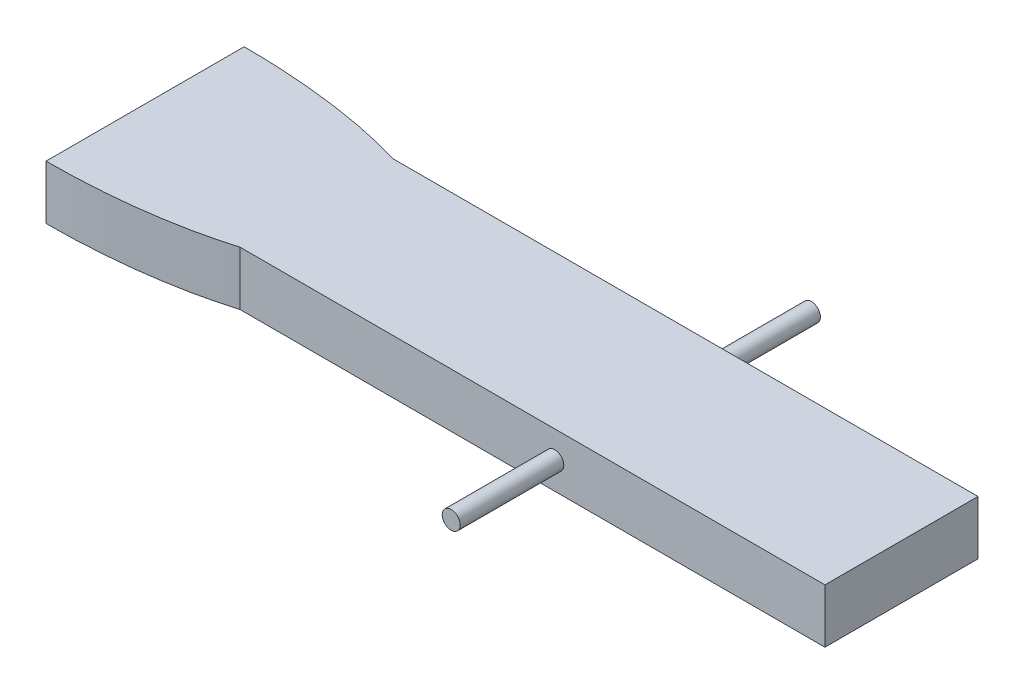
ISO-10303-21;
HEADER;
FILE_DESCRIPTION(('STEP AP214'),'2;1');
FILE_NAME('part.step','',(''),(''),'','','');
FILE_SCHEMA(('AUTOMOTIVE_DESIGN { 1 0 10303 214 1 1 1 1 }'));
ENDSEC;
DATA;
#1=APPLICATION_CONTEXT('core data for automotive mechanical design processes');
#2=APPLICATION_PROTOCOL_DEFINITION('international standard','automotive_design',2000,#1);
#3=PRODUCT_CONTEXT('',#1,'mechanical');
#4=PRODUCT('Part','Part','',(#3));
#5=PRODUCT_RELATED_PRODUCT_CATEGORY('part','',(#4));
#6=PRODUCT_DEFINITION_FORMATION('','',#4);
#7=PRODUCT_DEFINITION_CONTEXT('part definition',#1,'design');
#8=PRODUCT_DEFINITION('design','',#6,#7);
#9=PRODUCT_DEFINITION_SHAPE('','',#8);
#10=(LENGTH_UNIT() NAMED_UNIT(*) SI_UNIT(.MILLI.,.METRE.));
#11=(NAMED_UNIT(*) PLANE_ANGLE_UNIT() SI_UNIT($,.RADIAN.));
#12=(NAMED_UNIT(*) SI_UNIT($,.STERADIAN.) SOLID_ANGLE_UNIT());
#13=UNCERTAINTY_MEASURE_WITH_UNIT(LENGTH_MEASURE(1.E-05),#10,'distance_accuracy_value','');
#14=(GEOMETRIC_REPRESENTATION_CONTEXT(3) GLOBAL_UNCERTAINTY_ASSIGNED_CONTEXT((#13)) GLOBAL_UNIT_ASSIGNED_CONTEXT((#10,
#11,#12)) REPRESENTATION_CONTEXT('',''));
#15=CARTESIAN_POINT('',(0.,0.,0.));
#16=DIRECTION('',(0.,0.,1.));
#17=DIRECTION('',(1.,0.,0.));
#18=AXIS2_PLACEMENT_3D('',#15,#16,#17);
#19=CARTESIAN_POINT('',(-27.,1.5,5.5));
#20=DIRECTION('',(0.,-1.,0.));
#21=DIRECTION('',(1.,0.,0.));
#22=AXIS2_PLACEMENT_3D('',#19,#20,#21);
#23=PLANE('',#22);
#24=CARTESIAN_POINT('',(-27.,1.5,0.));
#25=DIRECTION('',(0.,1.,0.));
#26=DIRECTION('',(1.,0.,0.));
#27=AXIS2_PLACEMENT_3D('',#24,#25,#26);
#28=ELLIPSE('',#27,15.,5.5);
#29=CARTESIAN_POINT('',(-17.4789272428849,1.5,-4.25000000000001));
#30=VERTEX_POINT('',#29);
#31=CARTESIAN_POINT('',(-27.,1.5,-5.5));
#32=VERTEX_POINT('',#31);
#33=EDGE_CURVE('E132',#30,#32,#28,.T.);
#34=ORIENTED_EDGE('',*,*,#33,.T.);
#35=DIRECTION('',(0.,0.,-1.));
#36=VECTOR('',#35,1.);
#37=CARTESIAN_POINT('',(-27.,1.5,5.5));
#38=LINE('',#37,#36);
#39=CARTESIAN_POINT('',(-27.,1.5,5.5));
#40=VERTEX_POINT('',#39);
#41=EDGE_CURVE('E168',#40,#32,#38,.T.);
#42=ORIENTED_EDGE('',*,*,#41,.F.);
#43=CARTESIAN_POINT('',(-27.,1.5,0.));
#44=DIRECTION('',(0.,1.,0.));
#45=DIRECTION('',(1.,0.,0.));
#46=AXIS2_PLACEMENT_3D('',#43,#44,#45);
#47=ELLIPSE('',#46,15.,5.5);
#48=CARTESIAN_POINT('',(-17.4789272428849,1.5,4.25000000000002));
#49=VERTEX_POINT('',#48);
#50=EDGE_CURVE('E62',#40,#49,#47,.T.);
#51=ORIENTED_EDGE('',*,*,#50,.T.);
#52=DIRECTION('',(1.,0.,0.));
#53=VECTOR('',#52,1.);
#54=CARTESIAN_POINT('',(15.,1.5,4.25));
#55=LINE('',#54,#53);
#56=CARTESIAN_POINT('',(15.,1.5,4.25));
#57=VERTEX_POINT('',#56);
#58=EDGE_CURVE('E106',#49,#57,#55,.T.);
#59=ORIENTED_EDGE('',*,*,#58,.T.);
#60=DIRECTION('',(0.,0.,-1.));
#61=VECTOR('',#60,1.);
#62=CARTESIAN_POINT('',(15.,1.5,5.5));
#63=LINE('',#62,#61);
#64=CARTESIAN_POINT('',(15.,1.5,-4.25));
#65=VERTEX_POINT('',#64);
#66=EDGE_CURVE('E160',#57,#65,#63,.T.);
#67=ORIENTED_EDGE('',*,*,#66,.T.);
#68=DIRECTION('',(-1.,0.,0.));
#69=VECTOR('',#68,1.);
#70=CARTESIAN_POINT('',(15.,1.5,-4.25));
#71=LINE('',#70,#69);
#72=EDGE_CURVE('E141',#65,#30,#71,.T.);
#73=ORIENTED_EDGE('',*,*,#72,.T.);
#74=EDGE_LOOP('',(#34,#42,#51,#59,#67,#73));
#75=FACE_BOUND('',#74,.T.);
#76=ADVANCED_FACE('F46',(#75),#23,.F.);
#77=CARTESIAN_POINT('',(-27.,-1.5,5.5));
#78=DIRECTION('',(0.,1.,0.));
#79=DIRECTION('',(-1.,0.,0.));
#80=AXIS2_PLACEMENT_3D('',#77,#78,#79);
#81=PLANE('',#80);
#82=CARTESIAN_POINT('',(-27.,-1.5,0.));
#83=DIRECTION('',(0.,1.,0.));
#84=DIRECTION('',(1.,0.,0.));
#85=AXIS2_PLACEMENT_3D('',#82,#83,#84);
#86=ELLIPSE('',#85,15.,5.5);
#87=CARTESIAN_POINT('',(-17.4789272428849,-1.5,-4.25000000000001));
#88=VERTEX_POINT('',#87);
#89=CARTESIAN_POINT('',(-27.,-1.5,-5.5));
#90=VERTEX_POINT('',#89);
#91=EDGE_CURVE('E70',#88,#90,#86,.T.);
#92=ORIENTED_EDGE('',*,*,#91,.F.);
#93=DIRECTION('',(-1.,0.,0.));
#94=VECTOR('',#93,1.);
#95=CARTESIAN_POINT('',(15.,-1.5,-4.25));
#96=LINE('',#95,#94);
#97=CARTESIAN_POINT('',(15.,-1.5,-4.25));
#98=VERTEX_POINT('',#97);
#99=EDGE_CURVE('E109',#98,#88,#96,.T.);
#100=ORIENTED_EDGE('',*,*,#99,.F.);
#101=DIRECTION('',(0.,0.,-1.));
#102=VECTOR('',#101,1.);
#103=CARTESIAN_POINT('',(15.,-1.49999999999999,5.5));
#104=LINE('',#103,#102);
#105=CARTESIAN_POINT('',(15.,-1.5,4.25));
#106=VERTEX_POINT('',#105);
#107=EDGE_CURVE('E123',#106,#98,#104,.T.);
#108=ORIENTED_EDGE('',*,*,#107,.F.);
#109=DIRECTION('',(1.,0.,0.));
#110=VECTOR('',#109,1.);
#111=CARTESIAN_POINT('',(15.,-1.5,4.25));
#112=LINE('',#111,#110);
#113=CARTESIAN_POINT('',(-17.4789272428849,-1.5,4.25000000000002));
#114=VERTEX_POINT('',#113);
#115=EDGE_CURVE('E103',#114,#106,#112,.T.);
#116=ORIENTED_EDGE('',*,*,#115,.F.);
#117=CARTESIAN_POINT('',(-27.,-1.5,0.));
#118=DIRECTION('',(0.,1.,0.));
#119=DIRECTION('',(1.,0.,0.));
#120=AXIS2_PLACEMENT_3D('',#117,#118,#119);
#121=ELLIPSE('',#120,15.,5.5);
#122=CARTESIAN_POINT('',(-27.,-1.5,5.5));
#123=VERTEX_POINT('',#122);
#124=EDGE_CURVE('E112',#123,#114,#121,.T.);
#125=ORIENTED_EDGE('',*,*,#124,.F.);
#126=DIRECTION('',(0.,0.,-1.));
#127=VECTOR('',#126,1.);
#128=CARTESIAN_POINT('',(-27.,-1.5,5.5));
#129=LINE('',#128,#127);
#130=EDGE_CURVE('E166',#123,#90,#129,.T.);
#131=ORIENTED_EDGE('',*,*,#130,.T.);
#132=EDGE_LOOP('',(#92,#100,#108,#116,#125,#131));
#133=FACE_BOUND('',#132,.T.);
#134=ADVANCED_FACE('F120',(#133),#81,.F.);
#135=CARTESIAN_POINT('',(15.,-1.49999999999999,5.5));
#136=DIRECTION('',(-1.,0.,0.));
#137=DIRECTION('',(0.,0.,1.));
#138=AXIS2_PLACEMENT_3D('',#135,#136,#137);
#139=PLANE('',#138);
#140=DIRECTION('',(0.,1.,0.));
#141=VECTOR('',#140,1.);
#142=CARTESIAN_POINT('',(15.,-1.5,-4.25));
#143=LINE('',#142,#141);
#144=EDGE_CURVE('E149',#98,#65,#143,.T.);
#145=ORIENTED_EDGE('',*,*,#144,.T.);
#146=ORIENTED_EDGE('',*,*,#66,.F.);
#147=DIRECTION('',(0.,1.,0.));
#148=VECTOR('',#147,1.);
#149=CARTESIAN_POINT('',(15.,-1.5,4.25));
#150=LINE('',#149,#148);
#151=EDGE_CURVE('E108',#106,#57,#150,.T.);
#152=ORIENTED_EDGE('',*,*,#151,.F.);
#153=ORIENTED_EDGE('',*,*,#107,.T.);
#154=EDGE_LOOP('',(#145,#146,#152,#153));
#155=FACE_BOUND('',#154,.T.);
#156=ADVANCED_FACE('F198',(#155),#139,.F.);
#157=CARTESIAN_POINT('',(-27.,-1.5,5.5));
#158=DIRECTION('',(1.,0.,0.));
#159=DIRECTION('',(0.,0.,-1.));
#160=AXIS2_PLACEMENT_3D('',#157,#158,#159);
#161=PLANE('',#160);
#162=ORIENTED_EDGE('',*,*,#41,.T.);
#163=DIRECTION('',(0.,-1.,0.));
#164=VECTOR('',#163,1.);
#165=CARTESIAN_POINT('',(-27.,-1.5,-5.5));
#166=LINE('',#165,#164);
#167=EDGE_CURVE('E148',#32,#90,#166,.T.);
#168=ORIENTED_EDGE('',*,*,#167,.T.);
#169=ORIENTED_EDGE('',*,*,#130,.F.);
#170=DIRECTION('',(0.,-1.,0.));
#171=VECTOR('',#170,1.);
#172=CARTESIAN_POINT('',(-27.,-1.5,5.5));
#173=LINE('',#172,#171);
#174=EDGE_CURVE('E114',#40,#123,#173,.T.);
#175=ORIENTED_EDGE('',*,*,#174,.F.);
#176=EDGE_LOOP('',(#162,#168,#169,#175));
#177=FACE_BOUND('',#176,.T.);
#178=ADVANCED_FACE('F201',(#177),#161,.F.);
#179=DIRECTION('',(0.,1.,0.));
#180=VECTOR('',#179,1.);
#181=SURFACE_OF_LINEAR_EXTRUSION('',#86,#180);
#182=ORIENTED_EDGE('',*,*,#33,.F.);
#183=DIRECTION('',(0.,1.,0.));
#184=VECTOR('',#183,1.);
#185=CARTESIAN_POINT('',(-17.4789272428849,-1.5,-4.25000000000001));
#186=LINE('',#185,#184);
#187=EDGE_CURVE('E145',#88,#30,#186,.T.);
#188=ORIENTED_EDGE('',*,*,#187,.F.);
#189=ORIENTED_EDGE('',*,*,#91,.T.);
#190=ORIENTED_EDGE('',*,*,#167,.F.);
#191=EDGE_LOOP('',(#182,#188,#189,#190));
#192=FACE_BOUND('',#191,.T.);
#193=ADVANCED_FACE('F190',(#192),#181,.T.);
#194=CARTESIAN_POINT('',(15.,-1.5,-4.25));
#195=DIRECTION('',(0.,0.,-1.));
#196=DIRECTION('',(-1.,0.,0.));
#197=AXIS2_PLACEMENT_3D('',#194,#195,#196);
#198=PLANE('',#197);
#199=CARTESIAN_POINT('',(0.,0.,-4.25));
#200=DIRECTION('',(0.,0.,-1.));
#201=DIRECTION('',(-1.,0.,0.));
#202=AXIS2_PLACEMENT_3D('',#199,#200,#201);
#203=CIRCLE('',#202,0.5);
#204=CARTESIAN_POINT('',(-0.5,0.,-4.25));
#205=VERTEX_POINT('',#204);
#206=EDGE_CURVE('E12',#205,#205,#203,.T.);
#207=ORIENTED_EDGE('',*,*,#206,.F.);
#208=EDGE_LOOP('',(#207));
#209=FACE_BOUND('',#208,.T.);
#210=ORIENTED_EDGE('',*,*,#72,.F.);
#211=ORIENTED_EDGE('',*,*,#144,.F.);
#212=ORIENTED_EDGE('',*,*,#99,.T.);
#213=ORIENTED_EDGE('',*,*,#187,.T.);
#214=EDGE_LOOP('',(#210,#211,#212,#213));
#215=FACE_BOUND('',#214,.T.);
#216=ADVANCED_FACE('F181',(#209,#215),#198,.T.);
#217=CARTESIAN_POINT('',(15.,-1.5,4.25));
#218=DIRECTION('',(0.,0.,1.));
#219=DIRECTION('',(1.,0.,0.));
#220=AXIS2_PLACEMENT_3D('',#217,#218,#219);
#221=PLANE('',#220);
#222=CARTESIAN_POINT('',(0.,0.,4.25000000000001));
#223=DIRECTION('',(0.,0.,1.));
#224=DIRECTION('',(1.,0.,0.));
#225=AXIS2_PLACEMENT_3D('',#222,#223,#224);
#226=CIRCLE('',#225,0.5);
#227=CARTESIAN_POINT('',(0.5,0.,4.25000000000001));
#228=VERTEX_POINT('',#227);
#229=EDGE_CURVE('E49',#228,#228,#226,.T.);
#230=ORIENTED_EDGE('',*,*,#229,.F.);
#231=EDGE_LOOP('',(#230));
#232=FACE_BOUND('',#231,.T.);
#233=ORIENTED_EDGE('',*,*,#58,.F.);
#234=DIRECTION('',(0.,1.,0.));
#235=VECTOR('',#234,1.);
#236=CARTESIAN_POINT('',(-17.4789272428849,-1.5,4.25000000000002));
#237=LINE('',#236,#235);
#238=EDGE_CURVE('E99',#114,#49,#237,.T.);
#239=ORIENTED_EDGE('',*,*,#238,.F.);
#240=ORIENTED_EDGE('',*,*,#115,.T.);
#241=ORIENTED_EDGE('',*,*,#151,.T.);
#242=EDGE_LOOP('',(#233,#239,#240,#241));
#243=FACE_BOUND('',#242,.T.);
#244=ADVANCED_FACE('F101',(#232,#243),#221,.T.);
#245=DIRECTION('',(0.,1.,0.));
#246=VECTOR('',#245,1.);
#247=SURFACE_OF_LINEAR_EXTRUSION('',#121,#246);
#248=ORIENTED_EDGE('',*,*,#50,.F.);
#249=ORIENTED_EDGE('',*,*,#174,.T.);
#250=ORIENTED_EDGE('',*,*,#124,.T.);
#251=ORIENTED_EDGE('',*,*,#238,.T.);
#252=EDGE_LOOP('',(#248,#249,#250,#251));
#253=FACE_BOUND('',#252,.T.);
#254=ADVANCED_FACE('F113',(#253),#247,.T.);
#255=CARTESIAN_POINT('',(0.,0.,10.));
#256=DIRECTION('',(0.,0.,1.));
#257=DIRECTION('',(1.,0.,0.));
#258=AXIS2_PLACEMENT_3D('',#255,#256,#257);
#259=PLANE('',#258);
#260=CARTESIAN_POINT('',(0.,0.,10.));
#261=DIRECTION('',(0.,0.,1.));
#262=DIRECTION('',(1.,0.,0.));
#263=AXIS2_PLACEMENT_3D('',#260,#261,#262);
#264=CIRCLE('',#263,0.5);
#265=CARTESIAN_POINT('',(0.5,0.,10.));
#266=VERTEX_POINT('',#265);
#267=EDGE_CURVE('E278',#266,#266,#264,.T.);
#268=ORIENTED_EDGE('',*,*,#267,.T.);
#269=EDGE_LOOP('',(#268));
#270=FACE_BOUND('',#269,.T.);
#271=ADVANCED_FACE('F188',(#270),#259,.T.);
#272=CARTESIAN_POINT('',(0.,0.,-10.));
#273=DIRECTION('',(0.,0.,1.));
#274=DIRECTION('',(1.,0.,0.));
#275=AXIS2_PLACEMENT_3D('',#272,#273,#274);
#276=CYLINDRICAL_SURFACE('',#275,0.5);
#277=ORIENTED_EDGE('',*,*,#229,.T.);
#278=EDGE_LOOP('',(#277));
#279=FACE_BOUND('',#278,.T.);
#280=ORIENTED_EDGE('',*,*,#267,.F.);
#281=EDGE_LOOP('',(#280));
#282=FACE_BOUND('',#281,.T.);
#283=ADVANCED_FACE('F177',(#279,#282),#276,.T.);
#284=ORIENTED_EDGE('',*,*,#206,.T.);
#285=EDGE_LOOP('',(#284));
#286=FACE_BOUND('',#285,.T.);
#287=CARTESIAN_POINT('',(0.,0.,-10.));
#288=DIRECTION('',(0.,0.,1.));
#289=DIRECTION('',(1.,0.,0.));
#290=AXIS2_PLACEMENT_3D('',#287,#288,#289);
#291=CIRCLE('',#290,0.5);
#292=CARTESIAN_POINT('',(0.5,0.,-10.));
#293=VERTEX_POINT('',#292);
#294=EDGE_CURVE('E136',#293,#293,#291,.T.);
#295=ORIENTED_EDGE('',*,*,#294,.T.);
#296=EDGE_LOOP('',(#295));
#297=FACE_BOUND('',#296,.T.);
#298=ADVANCED_FACE('F251',(#286,#297),#276,.T.);
#299=CARTESIAN_POINT('',(0.,0.,-10.));
#300=DIRECTION('',(0.,0.,1.));
#301=DIRECTION('',(1.,0.,0.));
#302=AXIS2_PLACEMENT_3D('',#299,#300,#301);
#303=PLANE('',#302);
#304=ORIENTED_EDGE('',*,*,#294,.F.);
#305=EDGE_LOOP('',(#304));
#306=FACE_BOUND('',#305,.T.);
#307=ADVANCED_FACE('F259',(#306),#303,.F.);
#308=CLOSED_SHELL('',(#76,#134,#156,#178,#193,#216,#244,#254,#271,#283,#298,#307));
#309=MANIFOLD_SOLID_BREP('B2',#308);
#310=ADVANCED_BREP_SHAPE_REPRESENTATION('',(#18,#309),#14);
#311=SHAPE_DEFINITION_REPRESENTATION(#9,#310);
ENDSEC;
END-ISO-10303-21;
